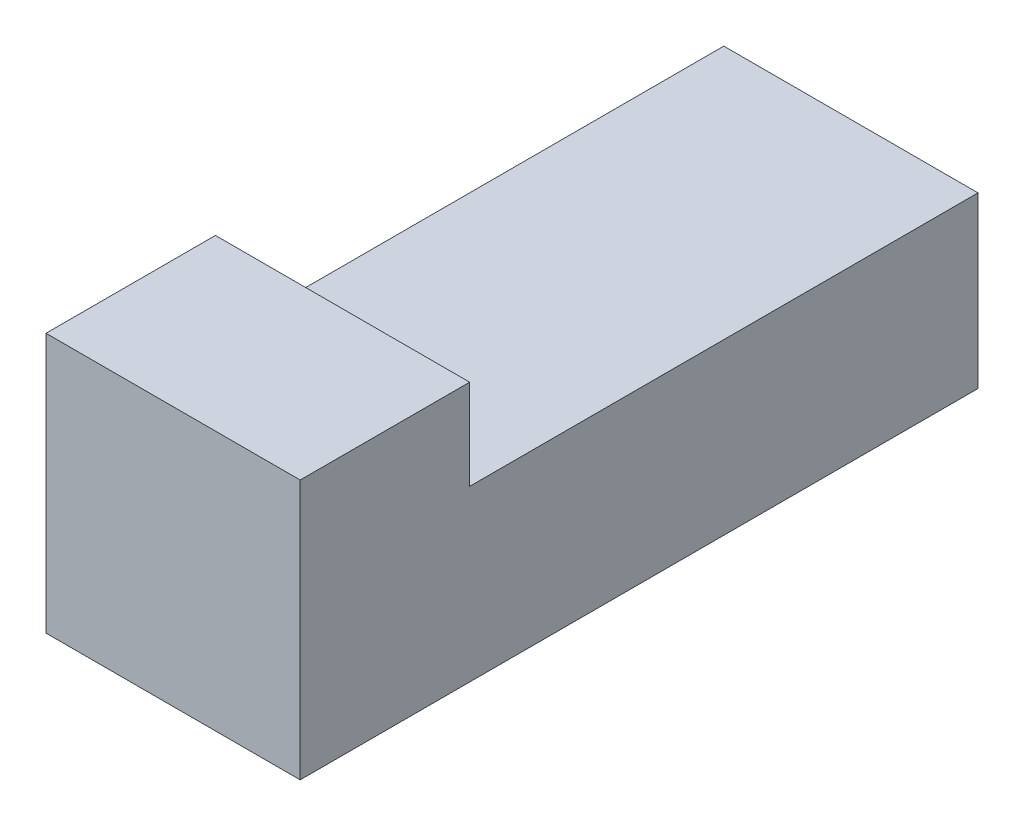
ISO-10303-21;
HEADER;
FILE_DESCRIPTION(('STEP AP214'),'2;1');
FILE_NAME('part.step','',(''),(''),'','','');
FILE_SCHEMA(('AUTOMOTIVE_DESIGN { 1 0 10303 214 1 1 1 1 }'));
ENDSEC;
DATA;
#1=APPLICATION_CONTEXT('core data for automotive mechanical design processes');
#2=APPLICATION_PROTOCOL_DEFINITION('international standard','automotive_design',2000,#1);
#3=PRODUCT_CONTEXT('',#1,'mechanical');
#4=PRODUCT('Part','Part','',(#3));
#5=PRODUCT_RELATED_PRODUCT_CATEGORY('part','',(#4));
#6=PRODUCT_DEFINITION_FORMATION('','',#4);
#7=PRODUCT_DEFINITION_CONTEXT('part definition',#1,'design');
#8=PRODUCT_DEFINITION('design','',#6,#7);
#9=PRODUCT_DEFINITION_SHAPE('','',#8);
#10=(LENGTH_UNIT() NAMED_UNIT(*) SI_UNIT(.MILLI.,.METRE.));
#11=(NAMED_UNIT(*) PLANE_ANGLE_UNIT() SI_UNIT($,.RADIAN.));
#12=(NAMED_UNIT(*) SI_UNIT($,.STERADIAN.) SOLID_ANGLE_UNIT());
#13=UNCERTAINTY_MEASURE_WITH_UNIT(LENGTH_MEASURE(1.E-05),#10,'distance_accuracy_value','');
#14=(GEOMETRIC_REPRESENTATION_CONTEXT(3) GLOBAL_UNCERTAINTY_ASSIGNED_CONTEXT((#13)) GLOBAL_UNIT_ASSIGNED_CONTEXT((#10,
#11,#12)) REPRESENTATION_CONTEXT('',''));
#15=CARTESIAN_POINT('',(0.,0.,0.));
#16=DIRECTION('',(0.,0.,1.));
#17=DIRECTION('',(1.,0.,0.));
#18=AXIS2_PLACEMENT_3D('',#15,#16,#17);
#19=CARTESIAN_POINT('',(300.,400.,0.));
#20=DIRECTION('',(0.,1.,0.));
#21=DIRECTION('',(0.,0.,1.));
#22=AXIS2_PLACEMENT_3D('',#19,#20,#21);
#23=PLANE('',#22);
#24=DIRECTION('',(0.,0.,-1.));
#25=VECTOR('',#24,1.);
#26=CARTESIAN_POINT('',(-300.,400.,0.));
#27=LINE('',#26,#25);
#28=CARTESIAN_POINT('',(-300.,400.,7664.99890709423));
#29=VERTEX_POINT('',#28);
#30=CARTESIAN_POINT('',(-300.,400.,6464.99890709423));
#31=VERTEX_POINT('',#30);
#32=EDGE_CURVE('E120',#29,#31,#27,.T.);
#33=ORIENTED_EDGE('',*,*,#32,.F.);
#34=DIRECTION('',(-1.,0.,0.));
#35=VECTOR('',#34,1.);
#36=CARTESIAN_POINT('',(300.,400.,7664.99890709423));
#37=LINE('',#36,#35);
#38=CARTESIAN_POINT('',(300.,400.,7664.99890709423));
#39=VERTEX_POINT('',#38);
#40=EDGE_CURVE('E11',#39,#29,#37,.T.);
#41=ORIENTED_EDGE('',*,*,#40,.F.);
#42=DIRECTION('',(0.,0.,-1.));
#43=VECTOR('',#42,1.);
#44=CARTESIAN_POINT('',(300.,400.,0.));
#45=LINE('',#44,#43);
#46=CARTESIAN_POINT('',(300.,400.,6464.99890709423));
#47=VERTEX_POINT('',#46);
#48=EDGE_CURVE('E134',#39,#47,#45,.T.);
#49=ORIENTED_EDGE('',*,*,#48,.T.);
#50=DIRECTION('',(-1.,0.,0.));
#51=VECTOR('',#50,1.);
#52=CARTESIAN_POINT('',(300.,400.,6464.99890709423));
#53=LINE('',#52,#51);
#54=EDGE_CURVE('E55',#47,#31,#53,.T.);
#55=ORIENTED_EDGE('',*,*,#54,.T.);
#56=EDGE_LOOP('',(#33,#41,#49,#55));
#57=FACE_BOUND('',#56,.T.);
#58=ADVANCED_FACE('F39',(#57),#23,.T.);
#59=CARTESIAN_POINT('',(300.,0.,7664.99890709423));
#60=DIRECTION('',(0.,0.,-1.));
#61=DIRECTION('',(-1.,0.,0.));
#62=AXIS2_PLACEMENT_3D('',#59,#60,#61);
#63=PLANE('',#62);
#64=DIRECTION('',(0.,-1.,0.));
#65=VECTOR('',#64,1.);
#66=CARTESIAN_POINT('',(-300.,0.,7664.99890709423));
#67=LINE('',#66,#65);
#68=CARTESIAN_POINT('',(-300.,613.,7664.99890709423));
#69=VERTEX_POINT('',#68);
#70=EDGE_CURVE('E122',#69,#29,#67,.T.);
#71=ORIENTED_EDGE('',*,*,#70,.F.);
#72=DIRECTION('',(-1.,0.,0.));
#73=VECTOR('',#72,1.);
#74=CARTESIAN_POINT('',(300.,613.,7664.99890709423));
#75=LINE('',#74,#73);
#76=CARTESIAN_POINT('',(300.,613.,7664.99890709423));
#77=VERTEX_POINT('',#76);
#78=EDGE_CURVE('E47',#77,#69,#75,.T.);
#79=ORIENTED_EDGE('',*,*,#78,.F.);
#80=DIRECTION('',(0.,-1.,0.));
#81=VECTOR('',#80,1.);
#82=CARTESIAN_POINT('',(300.,0.,7664.99890709423));
#83=LINE('',#82,#81);
#84=EDGE_CURVE('E209',#77,#39,#83,.T.);
#85=ORIENTED_EDGE('',*,*,#84,.T.);
#86=ORIENTED_EDGE('',*,*,#40,.T.);
#87=EDGE_LOOP('',(#71,#79,#85,#86));
#88=FACE_BOUND('',#87,.T.);
#89=ADVANCED_FACE('F143',(#88),#63,.T.);
#90=CARTESIAN_POINT('',(300.,613.,0.));
#91=DIRECTION('',(0.,1.,0.));
#92=DIRECTION('',(0.,0.,1.));
#93=AXIS2_PLACEMENT_3D('',#90,#91,#92);
#94=PLANE('',#93);
#95=DIRECTION('',(0.,0.,-1.));
#96=VECTOR('',#95,1.);
#97=CARTESIAN_POINT('',(-300.,613.,0.));
#98=LINE('',#97,#96);
#99=CARTESIAN_POINT('',(-300.,613.,8064.99890709423));
#100=VERTEX_POINT('',#99);
#101=EDGE_CURVE('E125',#100,#69,#98,.T.);
#102=ORIENTED_EDGE('',*,*,#101,.F.);
#103=DIRECTION('',(-1.,0.,0.));
#104=VECTOR('',#103,1.);
#105=CARTESIAN_POINT('',(300.,613.,8064.99890709423));
#106=LINE('',#105,#104);
#107=CARTESIAN_POINT('',(300.,613.,8064.99890709423));
#108=VERTEX_POINT('',#107);
#109=EDGE_CURVE('E102',#108,#100,#106,.T.);
#110=ORIENTED_EDGE('',*,*,#109,.F.);
#111=DIRECTION('',(0.,0.,-1.));
#112=VECTOR('',#111,1.);
#113=CARTESIAN_POINT('',(300.,613.,0.));
#114=LINE('',#113,#112);
#115=EDGE_CURVE('E112',#108,#77,#114,.T.);
#116=ORIENTED_EDGE('',*,*,#115,.T.);
#117=ORIENTED_EDGE('',*,*,#78,.T.);
#118=EDGE_LOOP('',(#102,#110,#116,#117));
#119=FACE_BOUND('',#118,.T.);
#120=ADVANCED_FACE('F140',(#119),#94,.T.);
#121=CARTESIAN_POINT('',(300.,0.,8064.99890709423));
#122=DIRECTION('',(0.,0.,1.));
#123=DIRECTION('',(1.,0.,0.));
#124=AXIS2_PLACEMENT_3D('',#121,#122,#123);
#125=PLANE('',#124);
#126=DIRECTION('',(0.,1.,0.));
#127=VECTOR('',#126,1.);
#128=CARTESIAN_POINT('',(-300.,0.,8064.99890709423));
#129=LINE('',#128,#127);
#130=CARTESIAN_POINT('',(-300.,0.,8064.99890709423));
#131=VERTEX_POINT('',#130);
#132=EDGE_CURVE('E98',#131,#100,#129,.T.);
#133=ORIENTED_EDGE('',*,*,#132,.F.);
#134=DIRECTION('',(-1.,0.,0.));
#135=VECTOR('',#134,1.);
#136=CARTESIAN_POINT('',(300.,0.,8064.99890709423));
#137=LINE('',#136,#135);
#138=CARTESIAN_POINT('',(300.,0.,8064.99890709423));
#139=VERTEX_POINT('',#138);
#140=EDGE_CURVE('E93',#139,#131,#137,.T.);
#141=ORIENTED_EDGE('',*,*,#140,.F.);
#142=DIRECTION('',(0.,1.,0.));
#143=VECTOR('',#142,1.);
#144=CARTESIAN_POINT('',(300.,0.,8064.99890709423));
#145=LINE('',#144,#143);
#146=EDGE_CURVE('E96',#139,#108,#145,.T.);
#147=ORIENTED_EDGE('',*,*,#146,.T.);
#148=ORIENTED_EDGE('',*,*,#109,.T.);
#149=EDGE_LOOP('',(#133,#141,#147,#148));
#150=FACE_BOUND('',#149,.T.);
#151=ADVANCED_FACE('F95',(#150),#125,.T.);
#152=CARTESIAN_POINT('',(300.,0.,0.));
#153=DIRECTION('',(0.,-1.,0.));
#154=DIRECTION('',(0.,0.,-1.));
#155=AXIS2_PLACEMENT_3D('',#152,#153,#154);
#156=PLANE('',#155);
#157=DIRECTION('',(0.,0.,1.));
#158=VECTOR('',#157,1.);
#159=CARTESIAN_POINT('',(-300.,0.,0.));
#160=LINE('',#159,#158);
#161=CARTESIAN_POINT('',(-300.,0.,6464.99890709423));
#162=VERTEX_POINT('',#161);
#163=EDGE_CURVE('E129',#162,#131,#160,.T.);
#164=ORIENTED_EDGE('',*,*,#163,.F.);
#165=DIRECTION('',(-1.,0.,0.));
#166=VECTOR('',#165,1.);
#167=CARTESIAN_POINT('',(300.,0.,6464.99890709423));
#168=LINE('',#167,#166);
#169=CARTESIAN_POINT('',(300.,0.,6464.99890709423));
#170=VERTEX_POINT('',#169);
#171=EDGE_CURVE('E74',#170,#162,#168,.T.);
#172=ORIENTED_EDGE('',*,*,#171,.F.);
#173=DIRECTION('',(0.,0.,1.));
#174=VECTOR('',#173,1.);
#175=CARTESIAN_POINT('',(300.,0.,0.));
#176=LINE('',#175,#174);
#177=EDGE_CURVE('E109',#170,#139,#176,.T.);
#178=ORIENTED_EDGE('',*,*,#177,.T.);
#179=ORIENTED_EDGE('',*,*,#140,.T.);
#180=EDGE_LOOP('',(#164,#172,#178,#179));
#181=FACE_BOUND('',#180,.T.);
#182=ADVANCED_FACE('F114',(#181),#156,.T.);
#183=CARTESIAN_POINT('',(300.,0.,6464.99890709423));
#184=DIRECTION('',(0.,0.,-1.));
#185=DIRECTION('',(-1.,0.,0.));
#186=AXIS2_PLACEMENT_3D('',#183,#184,#185);
#187=PLANE('',#186);
#188=DIRECTION('',(0.,-1.,0.));
#189=VECTOR('',#188,1.);
#190=CARTESIAN_POINT('',(-300.,0.,6464.99890709423));
#191=LINE('',#190,#189);
#192=EDGE_CURVE('E131',#31,#162,#191,.T.);
#193=ORIENTED_EDGE('',*,*,#192,.F.);
#194=ORIENTED_EDGE('',*,*,#54,.F.);
#195=DIRECTION('',(0.,-1.,0.));
#196=VECTOR('',#195,1.);
#197=CARTESIAN_POINT('',(300.,0.,6464.99890709423));
#198=LINE('',#197,#196);
#199=EDGE_CURVE('E115',#47,#170,#198,.T.);
#200=ORIENTED_EDGE('',*,*,#199,.T.);
#201=ORIENTED_EDGE('',*,*,#171,.T.);
#202=EDGE_LOOP('',(#193,#194,#200,#201));
#203=FACE_BOUND('',#202,.T.);
#204=ADVANCED_FACE('F146',(#203),#187,.T.);
#205=CARTESIAN_POINT('',(300.,0.,0.));
#206=DIRECTION('',(1.,0.,0.));
#207=DIRECTION('',(0.,0.,-1.));
#208=AXIS2_PLACEMENT_3D('',#205,#206,#207);
#209=PLANE('',#208);
#210=ORIENTED_EDGE('',*,*,#48,.F.);
#211=ORIENTED_EDGE('',*,*,#84,.F.);
#212=ORIENTED_EDGE('',*,*,#115,.F.);
#213=ORIENTED_EDGE('',*,*,#146,.F.);
#214=ORIENTED_EDGE('',*,*,#177,.F.);
#215=ORIENTED_EDGE('',*,*,#199,.F.);
#216=EDGE_LOOP('',(#210,#211,#212,#213,#214,#215));
#217=FACE_BOUND('',#216,.T.);
#218=ADVANCED_FACE('F107',(#217),#209,.T.);
#219=CARTESIAN_POINT('',(-300.,0.,0.));
#220=DIRECTION('',(1.,0.,0.));
#221=DIRECTION('',(0.,0.,-1.));
#222=AXIS2_PLACEMENT_3D('',#219,#220,#221);
#223=PLANE('',#222);
#224=ORIENTED_EDGE('',*,*,#32,.T.);
#225=ORIENTED_EDGE('',*,*,#192,.T.);
#226=ORIENTED_EDGE('',*,*,#163,.T.);
#227=ORIENTED_EDGE('',*,*,#132,.T.);
#228=ORIENTED_EDGE('',*,*,#101,.T.);
#229=ORIENTED_EDGE('',*,*,#70,.T.);
#230=EDGE_LOOP('',(#224,#225,#226,#227,#228,#229));
#231=FACE_BOUND('',#230,.T.);
#232=ADVANCED_FACE('F145',(#231),#223,.F.);
#233=CLOSED_SHELL('',(#58,#89,#120,#151,#182,#204,#218,#232));
#234=MANIFOLD_SOLID_BREP('B2',#233);
#235=ADVANCED_BREP_SHAPE_REPRESENTATION('',(#18,#234),#14);
#236=SHAPE_DEFINITION_REPRESENTATION(#9,#235);
ENDSEC;
END-ISO-10303-21;
